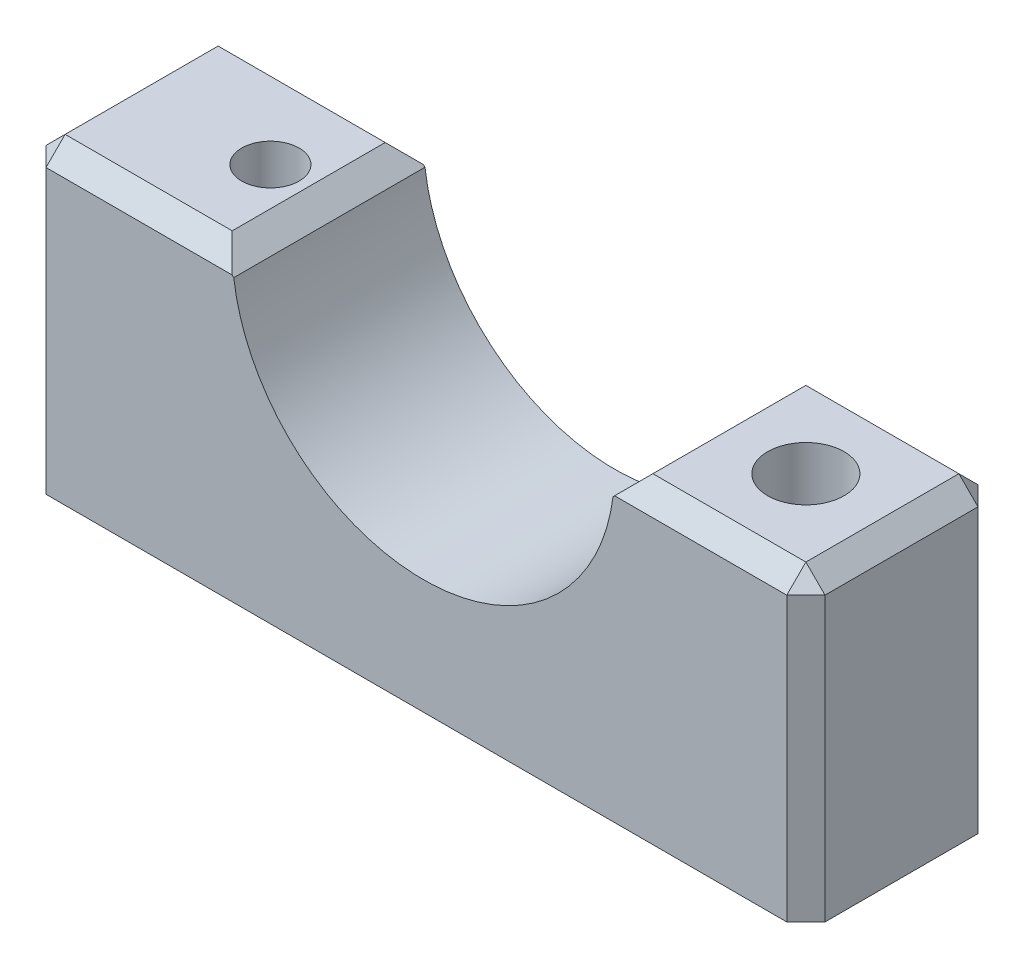
ISO-10303-21;
HEADER;
FILE_DESCRIPTION(('STEP AP214'),'2;1');
FILE_NAME('part.step','',(''),(''),'','','');
FILE_SCHEMA(('AUTOMOTIVE_DESIGN { 1 0 10303 214 1 1 1 1 }'));
ENDSEC;
DATA;
#1=APPLICATION_CONTEXT('core data for automotive mechanical design processes');
#2=APPLICATION_PROTOCOL_DEFINITION('international standard','automotive_design',2000,#1);
#3=PRODUCT_CONTEXT('',#1,'mechanical');
#4=PRODUCT('Part','Part','',(#3));
#5=PRODUCT_RELATED_PRODUCT_CATEGORY('part','',(#4));
#6=PRODUCT_DEFINITION_FORMATION('','',#4);
#7=PRODUCT_DEFINITION_CONTEXT('part definition',#1,'design');
#8=PRODUCT_DEFINITION('design','',#6,#7);
#9=PRODUCT_DEFINITION_SHAPE('','',#8);
#10=(LENGTH_UNIT() NAMED_UNIT(*) SI_UNIT(.MILLI.,.METRE.));
#11=(NAMED_UNIT(*) PLANE_ANGLE_UNIT() SI_UNIT($,.RADIAN.));
#12=(NAMED_UNIT(*) SI_UNIT($,.STERADIAN.) SOLID_ANGLE_UNIT());
#13=UNCERTAINTY_MEASURE_WITH_UNIT(LENGTH_MEASURE(1.E-05),#10,'distance_accuracy_value','');
#14=(GEOMETRIC_REPRESENTATION_CONTEXT(3) GLOBAL_UNCERTAINTY_ASSIGNED_CONTEXT((#13)) GLOBAL_UNIT_ASSIGNED_CONTEXT((#10,
#11,#12)) REPRESENTATION_CONTEXT('',''));
#15=CARTESIAN_POINT('',(0.,0.,0.));
#16=DIRECTION('',(0.,0.,1.));
#17=DIRECTION('',(1.,0.,0.));
#18=AXIS2_PLACEMENT_3D('',#15,#16,#17);
#19=CARTESIAN_POINT('',(-19.7351198682707,15.8,-5.));
#20=DIRECTION('',(0.707106781186547,0.,0.707106781186548));
#21=DIRECTION('',(0.,1.,0.));
#22=AXIS2_PLACEMENT_3D('',#19,#20,#21);
#23=PLANE('',#22);
#24=CARTESIAN_POINT('',(-20.2210739927541,2.7838656629798,-4.51404587551658));
#25=DIRECTION('',(0.707106781186547,0.,0.707106781186548));
#26=DIRECTION('',(-0.707106781186548,0.,0.707106781186547));
#27=AXIS2_PLACEMENT_3D('',#24,#25,#26);
#28=ELLIPSE('',#27,3.95979797464467,2.8);
#29=CARTESIAN_POINT('',(-20.7351198682707,5.53627494175074,-4.));
#30=VERTEX_POINT('',#29);
#31=CARTESIAN_POINT('',(-19.7351198682707,5.5413733400131,-5.));
#32=VERTEX_POINT('',#31);
#33=EDGE_CURVE('E204',#30,#32,#28,.F.);
#34=ORIENTED_EDGE('',*,*,#33,.F.);
#35=DIRECTION('',(0.,-1.,0.));
#36=VECTOR('',#35,1.);
#37=CARTESIAN_POINT('',(-20.7351198682707,1.98278893304149E-12,-4.));
#38=LINE('',#37,#36);
#39=CARTESIAN_POINT('',(-20.7351198682707,14.8,-4.));
#40=VERTEX_POINT('',#39);
#41=EDGE_CURVE('E202',#40,#30,#38,.T.);
#42=ORIENTED_EDGE('',*,*,#41,.F.);
#43=DIRECTION('',(0.707106781186548,0.,-0.707106781186547));
#44=VECTOR('',#43,1.);
#45=CARTESIAN_POINT('',(-20.2351198682707,14.8,-4.5));
#46=LINE('',#45,#44);
#47=CARTESIAN_POINT('',(-19.7351198682707,14.8,-5.));
#48=VERTEX_POINT('',#47);
#49=EDGE_CURVE('E264',#48,#40,#46,.F.);
#50=ORIENTED_EDGE('',*,*,#49,.F.);
#51=DIRECTION('',(0.,1.,0.));
#52=VECTOR('',#51,1.);
#53=CARTESIAN_POINT('',(-19.7351198682707,15.8,-5.));
#54=LINE('',#53,#52);
#55=EDGE_CURVE('E438',#32,#48,#54,.T.);
#56=ORIENTED_EDGE('',*,*,#55,.F.);
#57=EDGE_LOOP('',(#34,#42,#50,#56));
#58=FACE_BOUND('',#57,.T.);
#59=ADVANCED_FACE('F36',(#58),#23,.F.);
#60=CARTESIAN_POINT('',(-19.7351198682707,0.0263579859465096,-5.));
#61=VERTEX_POINT('',#60);
#62=CARTESIAN_POINT('',(-19.9209207477575,0.,-4.81419912051325));
#63=VERTEX_POINT('',#62);
#64=EDGE_CURVE('E201',#61,#63,#28,.F.);
#65=ORIENTED_EDGE('',*,*,#64,.F.);
#66=CARTESIAN_POINT('',(-19.7351198682707,0.,-5.));
#67=VERTEX_POINT('',#66);
#68=EDGE_CURVE('E429',#67,#61,#54,.T.);
#69=ORIENTED_EDGE('',*,*,#68,.F.);
#70=DIRECTION('',(-0.707106781186548,0.,0.707106781186547));
#71=VECTOR('',#70,1.);
#72=CARTESIAN_POINT('',(-19.7351198682707,0.,-5.));
#73=LINE('',#72,#71);
#74=EDGE_CURVE('E430',#63,#67,#73,.F.);
#75=ORIENTED_EDGE('',*,*,#74,.F.);
#76=EDGE_LOOP('',(#65,#69,#75));
#77=FACE_BOUND('',#76,.T.);
#78=ADVANCED_FACE('F410',(#77),#23,.F.);
#79=CARTESIAN_POINT('',(0.,15.8,0.));
#80=DIRECTION('',(0.,1.,0.));
#81=DIRECTION('',(0.,0.,1.));
#82=AXIS2_PLACEMENT_3D('',#79,#80,#81);
#83=PLANE('',#82);
#84=DIRECTION('',(1.,0.,0.));
#85=VECTOR('',#84,1.);
#86=CARTESIAN_POINT('',(-9.99799979996,15.8,4.));
#87=LINE('',#86,#85);
#88=CARTESIAN_POINT('',(-19.7351198682707,15.8,4.));
#89=VERTEX_POINT('',#88);
#90=CARTESIAN_POINT('',(-10.99799979996,15.8,4.));
#91=VERTEX_POINT('',#90);
#92=EDGE_CURVE('E476',#89,#91,#87,.T.);
#93=ORIENTED_EDGE('',*,*,#92,.T.);
#94=DIRECTION('',(0.,0.,-1.));
#95=VECTOR('',#94,1.);
#96=CARTESIAN_POINT('',(-10.99799979996,15.8,-5.));
#97=LINE('',#96,#95);
#98=CARTESIAN_POINT('',(-10.99799979996,15.8,-4.));
#99=VERTEX_POINT('',#98);
#100=EDGE_CURVE('E480',#91,#99,#97,.T.);
#101=ORIENTED_EDGE('',*,*,#100,.T.);
#102=DIRECTION('',(-1.,0.,0.));
#103=VECTOR('',#102,1.);
#104=CARTESIAN_POINT('',(-20.7351198682707,15.8,-4.));
#105=LINE('',#104,#103);
#106=CARTESIAN_POINT('',(-19.7351198682707,15.8,-4.));
#107=VERTEX_POINT('',#106);
#108=EDGE_CURVE('E478',#99,#107,#105,.T.);
#109=ORIENTED_EDGE('',*,*,#108,.T.);
#110=DIRECTION('',(0.,0.,1.));
#111=VECTOR('',#110,1.);
#112=CARTESIAN_POINT('',(-19.7351198682707,15.8,5.));
#113=LINE('',#112,#111);
#114=EDGE_CURVE('E474',#107,#89,#113,.T.);
#115=ORIENTED_EDGE('',*,*,#114,.T.);
#116=EDGE_LOOP('',(#93,#101,#109,#115));
#117=FACE_BOUND('',#116,.T.);
#118=CARTESIAN_POINT('',(-13.,15.8,0.));
#119=DIRECTION('',(0.,1.,0.));
#120=DIRECTION('',(0.,0.,1.));
#121=AXIS2_PLACEMENT_3D('',#118,#119,#120);
#122=CIRCLE('',#121,1.5);
#123=CARTESIAN_POINT('',(-13.,15.8,1.5));
#124=VERTEX_POINT('',#123);
#125=EDGE_CURVE('E526',#124,#124,#122,.T.);
#126=ORIENTED_EDGE('',*,*,#125,.F.);
#127=EDGE_LOOP('',(#126));
#128=FACE_BOUND('',#127,.T.);
#129=ADVANCED_FACE('F416',(#117,#128),#83,.T.);
#130=DIRECTION('',(-1.,0.,0.));
#131=VECTOR('',#130,1.);
#132=CARTESIAN_POINT('',(9.99799979996,15.8,-3.99999999999999));
#133=LINE('',#132,#131);
#134=CARTESIAN_POINT('',(19.,15.8,-3.99999999999999));
#135=VERTEX_POINT('',#134);
#136=CARTESIAN_POINT('',(10.99799979996,15.8,-3.99999999999999));
#137=VERTEX_POINT('',#136);
#138=EDGE_CURVE('E455',#135,#137,#133,.T.);
#139=ORIENTED_EDGE('',*,*,#138,.T.);
#140=DIRECTION('',(0.,0.,1.));
#141=VECTOR('',#140,1.);
#142=CARTESIAN_POINT('',(10.99799979996,15.8,5.));
#143=LINE('',#142,#141);
#144=CARTESIAN_POINT('',(10.99799979996,15.8,3.99999999999999));
#145=VERTEX_POINT('',#144);
#146=EDGE_CURVE('E459',#137,#145,#143,.T.);
#147=ORIENTED_EDGE('',*,*,#146,.T.);
#148=DIRECTION('',(1.,0.,0.));
#149=VECTOR('',#148,1.);
#150=CARTESIAN_POINT('',(20.,15.8,3.99999999999999));
#151=LINE('',#150,#149);
#152=CARTESIAN_POINT('',(19.,15.8,3.99999999999999));
#153=VERTEX_POINT('',#152);
#154=EDGE_CURVE('E457',#145,#153,#151,.T.);
#155=ORIENTED_EDGE('',*,*,#154,.T.);
#156=DIRECTION('',(0.,0.,-1.));
#157=VECTOR('',#156,1.);
#158=CARTESIAN_POINT('',(19.,15.8,-5.));
#159=LINE('',#158,#157);
#160=EDGE_CURVE('E453',#153,#135,#159,.T.);
#161=ORIENTED_EDGE('',*,*,#160,.T.);
#162=EDGE_LOOP('',(#139,#147,#155,#161));
#163=FACE_BOUND('',#162,.T.);
#164=CARTESIAN_POINT('',(15.,15.8,0.));
#165=DIRECTION('',(0.,1.,0.));
#166=DIRECTION('',(0.,0.,1.));
#167=AXIS2_PLACEMENT_3D('',#164,#165,#166);
#168=CIRCLE('',#167,2.);
#169=CARTESIAN_POINT('',(15.,15.8,2.));
#170=VERTEX_POINT('',#169);
#171=EDGE_CURVE('E520',#170,#170,#168,.T.);
#172=ORIENTED_EDGE('',*,*,#171,.F.);
#173=EDGE_LOOP('',(#172));
#174=FACE_BOUND('',#173,.T.);
#175=ADVANCED_FACE('F421',(#163,#174),#83,.T.);
#176=CARTESIAN_POINT('',(0.,0.,0.));
#177=DIRECTION('',(0.,1.,0.));
#178=DIRECTION('',(0.,0.,1.));
#179=AXIS2_PLACEMENT_3D('',#176,#177,#178);
#180=PLANE('',#179);
#181=DIRECTION('',(-1.,0.,0.));
#182=VECTOR('',#181,1.);
#183=CARTESIAN_POINT('',(-18.9351198682707,0.,-4.21389263051991));
#184=LINE('',#183,#182);
#185=CARTESIAN_POINT('',(-20.5212272377508,0.,-4.21389263051991));
#186=VERTEX_POINT('',#185);
#187=CARTESIAN_POINT('',(-19.4351198682707,0.,-4.21389263051991));
#188=VERTEX_POINT('',#187);
#189=EDGE_CURVE('E196',#186,#188,#184,.F.);
#190=ORIENTED_EDGE('',*,*,#189,.T.);
#191=CARTESIAN_POINT('',(-19.4351198682707,0.,-4.21389263051991));
#192=CARTESIAN_POINT('',(-19.4313810424922,0.,-4.21387913317386));
#193=CARTESIAN_POINT('',(-19.4276613431759,0.,-4.21428305676196));
#194=CARTESIAN_POINT('',(-19.4204196989587,0.,-4.21579695422611));
#195=CARTESIAN_POINT('',(-19.4168957177988,0.,-4.21689698903901));
#196=CARTESIAN_POINT('',(-19.4101146582667,0.,-4.21967240536886));
#197=CARTESIAN_POINT('',(-19.4068561287866,0.,-4.22134435652536));
#198=CARTESIAN_POINT('',(-19.400598319731,0.,-4.22513341580674));
#199=CARTESIAN_POINT('',(-19.3976000795394,0.,-4.22725220231526));
#200=CARTESIAN_POINT('',(-19.3895563942402,0.,-4.23366110845835));
#201=CARTESIAN_POINT('',(-19.3848101427737,0.,-4.23832422321387));
#202=CARTESIAN_POINT('',(-19.3760476001414,0.,-4.24828666655887));
#203=CARTESIAN_POINT('',(-19.3720335291475,0.,-4.25358785185492));
#204=CARTESIAN_POINT('',(-19.360844748602,0.,-4.27011486932161));
#205=CARTESIAN_POINT('',(-19.3545552721305,0.,-4.28193354134266));
#206=CARTESIAN_POINT('',(-19.3435934223491,0.,-4.30627393252372));
#207=CARTESIAN_POINT('',(-19.3389249586039,0.,-4.31879726789593));
#208=CARTESIAN_POINT('',(-19.3258891477024,0.,-4.3595057096732));
#209=CARTESIAN_POINT('',(-19.3198207428673,0.,-4.38842252844659));
#210=CARTESIAN_POINT('',(-19.3116197866411,0.,-4.44685547233927));
#211=CARTESIAN_POINT('',(-19.3095065650205,0.,-4.47637383171294));
#212=CARTESIAN_POINT('',(-19.3087977392633,0.,-4.53921188502588));
#213=CARTESIAN_POINT('',(-19.3106846273333,0.,-4.57253671905516));
#214=CARTESIAN_POINT('',(-19.3193932443883,0.,-4.63839923141753));
#215=CARTESIAN_POINT('',(-19.3261722206847,0.,-4.67094122201783));
#216=CARTESIAN_POINT('',(-19.3392594639429,0.,-4.70981796296075));
#217=CARTESIAN_POINT('',(-19.342036027177,0.,-4.71733555947856));
#218=CARTESIAN_POINT('',(-19.3481537951946,0.,-4.7321808161283));
#219=CARTESIAN_POINT('',(-19.3514974518704,0.,-4.73950748492457));
#220=CARTESIAN_POINT('',(-19.3598700716283,0.,-4.75579974385417));
#221=CARTESIAN_POINT('',(-19.3651094210256,0.,-4.7646587865983));
#222=CARTESIAN_POINT('',(-19.3770625232808,0.,-4.78132131766806));
#223=CARTESIAN_POINT('',(-19.3837641539983,0.,-4.7891326785205));
#224=CARTESIAN_POINT('',(-19.3943398357853,0.,-4.79833195324178));
#225=CARTESIAN_POINT('',(-19.3973655883036,0.,-4.80068458576905));
#226=CARTESIAN_POINT('',(-19.4037159751665,0.,-4.80495156659268));
#227=CARTESIAN_POINT('',(-19.4070403894557,0.,-4.8068662339546));
#228=CARTESIAN_POINT('',(-19.4134660518498,0.,-4.80987758447169));
#229=CARTESIAN_POINT('',(-19.416530168103,0.,-4.81105247496181));
#230=CARTESIAN_POINT('',(-19.4228084346918,0.,-4.81287441134433));
#231=CARTESIAN_POINT('',(-19.426022189039,0.,-4.81352277503577));
#232=CARTESIAN_POINT('',(-19.431209936898,0.,-4.81409291182164));
#233=CARTESIAN_POINT('',(-19.4331647711745,0.,-4.81420171723716));
#234=CARTESIAN_POINT('',(-19.4351198682707,0.,-4.8141991205133));
#235=B_SPLINE_CURVE_WITH_KNOTS('',3,(#191,#192,#193,#194,#195,#196,#197,#198,#199,#200,#201,
#202,#203,#204,#205,#206,#207,#208,#209,#210,#211,#212,#213,#214,#215,#216,#217,#218,#219,#220,
#221,#222,#223,#224,#225,#226,#227,#228,#229,#230,#231,#232,#233,#234),.UNSPECIFIED.,.F.,.F.,(4,
2,2,2,2,2,2,2,2,2,2,2,2,2,2,2,2,2,2,2,2,4),(0.,0.0111644738153716,0.02217303112856,
0.0331166843087431,0.0441021999975022,0.0639478582902646,0.0838527283961917,0.123791819017559,
0.163826576519271,0.251983033196454,0.340569214325398,0.440442335190599,0.539453058798515,
0.563478851238478,0.587611301276353,0.618412058724422,0.648966576267191,0.660437127701687,
0.671899295826087,0.681705728344835,0.691487540873906,0.697350297987625),.UNSPECIFIED.);
#236=CARTESIAN_POINT('',(-19.4351198682707,0.,-4.81419912051325));
#237=VERTEX_POINT('',#236);
#238=EDGE_CURVE('E50',#188,#237,#235,.T.);
#239=ORIENTED_EDGE('',*,*,#238,.T.);
#240=DIRECTION('',(-1.,0.,0.));
#241=VECTOR('',#240,1.);
#242=CARTESIAN_POINT('',(-18.9351198682707,0.,-4.81419912051325));
#243=LINE('',#242,#241);
#244=EDGE_CURVE('E511',#237,#63,#243,.T.);
#245=ORIENTED_EDGE('',*,*,#244,.T.);
#246=ORIENTED_EDGE('',*,*,#74,.T.);
#247=DIRECTION('',(-1.,0.,0.));
#248=VECTOR('',#247,1.);
#249=CARTESIAN_POINT('',(-18.,0.,-5.));
#250=LINE('',#249,#248);
#251=CARTESIAN_POINT('',(19.,0.,-5.));
#252=VERTEX_POINT('',#251);
#253=EDGE_CURVE('E436',#252,#67,#250,.T.);
#254=ORIENTED_EDGE('',*,*,#253,.F.);
#255=DIRECTION('',(-0.707106781186549,0.,-0.707106781186546));
#256=VECTOR('',#255,1.);
#257=CARTESIAN_POINT('',(19.,0.,-5.));
#258=LINE('',#257,#256);
#259=CARTESIAN_POINT('',(20.,0.,-3.99999999999999));
#260=VERTEX_POINT('',#259);
#261=EDGE_CURVE('E488',#252,#260,#258,.F.);
#262=ORIENTED_EDGE('',*,*,#261,.T.);
#263=DIRECTION('',(0.,0.,-1.));
#264=VECTOR('',#263,1.);
#265=CARTESIAN_POINT('',(20.,0.,-5.));
#266=LINE('',#265,#264);
#267=CARTESIAN_POINT('',(20.,0.,3.99999999999999));
#268=VERTEX_POINT('',#267);
#269=EDGE_CURVE('E529',#268,#260,#266,.T.);
#270=ORIENTED_EDGE('',*,*,#269,.F.);
#271=DIRECTION('',(0.707106781186549,0.,-0.707106781186546));
#272=VECTOR('',#271,1.);
#273=CARTESIAN_POINT('',(20.,0.,3.99999999999999));
#274=LINE('',#273,#272);
#275=CARTESIAN_POINT('',(19.,0.,5.));
#276=VERTEX_POINT('',#275);
#277=EDGE_CURVE('E486',#268,#276,#274,.F.);
#278=ORIENTED_EDGE('',*,*,#277,.T.);
#279=DIRECTION('',(1.,0.,0.));
#280=VECTOR('',#279,1.);
#281=CARTESIAN_POINT('',(-18.,0.,5.));
#282=LINE('',#281,#280);
#283=CARTESIAN_POINT('',(-19.7351198682707,0.,5.));
#284=VERTEX_POINT('',#283);
#285=EDGE_CURVE('E535',#284,#276,#282,.T.);
#286=ORIENTED_EDGE('',*,*,#285,.F.);
#287=DIRECTION('',(0.707106781186547,0.,0.707106781186548));
#288=VECTOR('',#287,1.);
#289=CARTESIAN_POINT('',(-19.7351198682707,0.,5.));
#290=LINE('',#289,#288);
#291=CARTESIAN_POINT('',(-20.7351198682707,0.,4.));
#292=VERTEX_POINT('',#291);
#293=EDGE_CURVE('E483',#284,#292,#290,.F.);
#294=ORIENTED_EDGE('',*,*,#293,.T.);
#295=DIRECTION('',(0.,0.,-1.));
#296=VECTOR('',#295,1.);
#297=CARTESIAN_POINT('',(-20.7351198682707,0.,-5.));
#298=LINE('',#297,#296);
#299=CARTESIAN_POINT('',(-20.7351198682707,0.,-4.));
#300=VERTEX_POINT('',#299);
#301=EDGE_CURVE('E245',#292,#300,#298,.T.);
#302=ORIENTED_EDGE('',*,*,#301,.T.);
#303=EDGE_CURVE('E214',#300,#186,#73,.F.);
#304=ORIENTED_EDGE('',*,*,#303,.T.);
#305=EDGE_LOOP('',(#190,#239,#245,#246,#254,#262,#270,#278,#286,#294,#302,#304));
#306=FACE_BOUND('',#305,.T.);
#307=CARTESIAN_POINT('',(-13.,0.,0.));
#308=DIRECTION('',(0.,1.,0.));
#309=DIRECTION('',(0.,0.,1.));
#310=AXIS2_PLACEMENT_3D('',#307,#308,#309);
#311=CIRCLE('',#310,1.5);
#312=CARTESIAN_POINT('',(-13.,0.,1.5));
#313=VERTEX_POINT('',#312);
#314=EDGE_CURVE('E523',#313,#313,#311,.T.);
#315=ORIENTED_EDGE('',*,*,#314,.T.);
#316=EDGE_LOOP('',(#315));
#317=FACE_BOUND('',#316,.T.);
#318=CARTESIAN_POINT('',(15.,0.,0.));
#319=DIRECTION('',(0.,1.,0.));
#320=DIRECTION('',(0.,0.,1.));
#321=AXIS2_PLACEMENT_3D('',#318,#319,#320);
#322=CIRCLE('',#321,2.);
#323=CARTESIAN_POINT('',(15.,0.,2.));
#324=VERTEX_POINT('',#323);
#325=EDGE_CURVE('E519',#324,#324,#322,.T.);
#326=ORIENTED_EDGE('',*,*,#325,.T.);
#327=EDGE_LOOP('',(#326));
#328=FACE_BOUND('',#327,.T.);
#329=ADVANCED_FACE('F299',(#306,#317,#328),#180,.F.);
#330=CARTESIAN_POINT('',(20.,15.8,-5.));
#331=DIRECTION('',(-1.,0.,0.));
#332=DIRECTION('',(0.,0.,1.));
#333=AXIS2_PLACEMENT_3D('',#330,#331,#332);
#334=PLANE('',#333);
#335=ORIENTED_EDGE('',*,*,#269,.T.);
#336=DIRECTION('',(0.,1.,0.));
#337=VECTOR('',#336,1.);
#338=CARTESIAN_POINT('',(20.,15.8,-3.99999999999999));
#339=LINE('',#338,#337);
#340=CARTESIAN_POINT('',(20.,14.8,-3.99999999999999));
#341=VERTEX_POINT('',#340);
#342=EDGE_CURVE('E494',#260,#341,#339,.T.);
#343=ORIENTED_EDGE('',*,*,#342,.T.);
#344=DIRECTION('',(0.,0.,1.));
#345=VECTOR('',#344,1.);
#346=CARTESIAN_POINT('',(20.,14.8,5.));
#347=LINE('',#346,#345);
#348=CARTESIAN_POINT('',(20.,14.8,3.99999999999999));
#349=VERTEX_POINT('',#348);
#350=EDGE_CURVE('E490',#341,#349,#347,.T.);
#351=ORIENTED_EDGE('',*,*,#350,.T.);
#352=DIRECTION('',(0.,-1.,0.));
#353=VECTOR('',#352,1.);
#354=CARTESIAN_POINT('',(20.,15.8,3.99999999999999));
#355=LINE('',#354,#353);
#356=EDGE_CURVE('E492',#349,#268,#355,.T.);
#357=ORIENTED_EDGE('',*,*,#356,.T.);
#358=EDGE_LOOP('',(#335,#343,#351,#357));
#359=FACE_BOUND('',#358,.T.);
#360=ADVANCED_FACE('F294',(#359),#334,.F.);
#361=CARTESIAN_POINT('',(-18.,15.8,-5.));
#362=DIRECTION('',(0.,0.,1.));
#363=DIRECTION('',(1.,0.,0.));
#364=AXIS2_PLACEMENT_3D('',#361,#362,#363);
#365=PLANE('',#364);
#366=DIRECTION('',(0.,-1.,0.));
#367=VECTOR('',#366,1.);
#368=CARTESIAN_POINT('',(-18.9351198682707,15.8,-5.));
#369=LINE('',#368,#367);
#370=CARTESIAN_POINT('',(-18.9351198682707,5.03194230511137,-5.));
#371=VERTEX_POINT('',#370);
#372=CARTESIAN_POINT('',(-18.9351198682707,0.535789020848232,-5.));
#373=VERTEX_POINT('',#372);
#374=EDGE_CURVE('E269',#371,#373,#369,.T.);
#375=ORIENTED_EDGE('',*,*,#374,.F.);
#376=CARTESIAN_POINT('',(-18.9351198682707,5.03194230511137,-5.));
#377=CARTESIAN_POINT('',(-18.9350967117054,5.06104456182236,-5.));
#378=CARTESIAN_POINT('',(-18.937546081478,5.09014679720615,-5.));
#379=CARTESIAN_POINT('',(-18.9472525902724,5.14753743241438,-5.));
#380=CARTESIAN_POINT('',(-18.9545096179752,5.1758258510665,-5.));
#381=CARTESIAN_POINT('',(-18.9737025430467,5.23080046351944,-5.));
#382=CARTESIAN_POINT('',(-18.985642518639,5.25748523733668,-5.));
#383=CARTESIAN_POINT('',(-19.0138866168703,5.308423577815,-5.));
#384=CARTESIAN_POINT('',(-19.0301888611976,5.33267818469738,-5.));
#385=CARTESIAN_POINT('',(-19.066477794981,5.37772613588793,-5.));
#386=CARTESIAN_POINT('',(-19.0864129088312,5.39856101156667,-5.));
#387=CARTESIAN_POINT('',(-19.1295605983609,5.43651895245994,-5.));
#388=CARTESIAN_POINT('',(-19.152773753704,5.45364135982938,-5.));
#389=CARTESIAN_POINT('',(-19.2013676211438,5.48336441596684,-5.));
#390=CARTESIAN_POINT('',(-19.2267028751971,5.49603949942158,-5.));
#391=CARTESIAN_POINT('',(-19.2791537386339,5.51688340205466,-5.));
#392=CARTESIAN_POINT('',(-19.3062678623442,5.52505592937865,-5.));
#393=CARTESIAN_POINT('',(-19.3505109718783,5.53435000855382,-5.));
#394=CARTESIAN_POINT('',(-19.3673370554203,5.53698241791821,-5.));
#395=CARTESIAN_POINT('',(-19.401146118257,5.54049352911248,-5.));
#396=CARTESIAN_POINT('',(-19.4181288301202,5.54137480688648,-5.));
#397=CARTESIAN_POINT('',(-19.4351198682707,5.54137334001309,-5.));
#398=B_SPLINE_CURVE_WITH_KNOTS('',3,(#376,#377,#378,#379,#380,#381,#382,#383,#384,#385,#386,
#387,#388,#389,#390,#391,#392,#393,#394,#395,#396,#397),.UNSPECIFIED.,.F.,.F.,(4,2,2,2,2,2,2,2,
2,2,4),(0.,0.0872045075069612,0.174406995908372,0.261685595284156,0.348926674420733,
0.435014042296966,0.521116652310992,0.605700437830247,0.690214458611445,0.741223535876962,
0.792157522215566),.UNSPECIFIED.);
#399=CARTESIAN_POINT('',(-19.4351198682707,5.54137334001309,-5.));
#400=VERTEX_POINT('',#399);
#401=EDGE_CURVE('E278',#371,#400,#398,.T.);
#402=ORIENTED_EDGE('',*,*,#401,.T.);
#403=DIRECTION('',(-1.,0.,0.));
#404=VECTOR('',#403,1.);
#405=CARTESIAN_POINT('',(-18.9351198682707,5.54137334001309,-5.));
#406=LINE('',#405,#404);
#407=EDGE_CURVE('E250',#400,#32,#406,.T.);
#408=ORIENTED_EDGE('',*,*,#407,.T.);
#409=ORIENTED_EDGE('',*,*,#55,.T.);
#410=DIRECTION('',(1.,0.,0.));
#411=VECTOR('',#410,1.);
#412=CARTESIAN_POINT('',(-9.99799979996,14.8,-5.));
#413=LINE('',#412,#411);
#414=CARTESIAN_POINT('',(-9.99799979996001,14.8,-5.));
#415=VERTEX_POINT('',#414);
#416=EDGE_CURVE('E437',#48,#415,#413,.T.);
#417=ORIENTED_EDGE('',*,*,#416,.T.);
#418=DIRECTION('',(-0.707106781186546,0.707106781186549,0.));
#419=VECTOR('',#418,1.);
#420=CARTESIAN_POINT('',(-9.91770342303226,14.7197036230723,-5.));
#421=LINE('',#420,#419);
#422=CARTESIAN_POINT('',(-9.91770342303226,14.7197036230723,-5.));
#423=VERTEX_POINT('',#422);
#424=EDGE_CURVE('E440',#415,#423,#421,.F.);
#425=ORIENTED_EDGE('',*,*,#424,.T.);
#426=CARTESIAN_POINT('',(0.,16.,-5.));
#427=DIRECTION('',(0.,0.,1.));
#428=DIRECTION('',(1.,0.,0.));
#429=AXIS2_PLACEMENT_3D('',#426,#427,#428);
#430=CIRCLE('',#429,10.);
#431=CARTESIAN_POINT('',(9.91770342303226,14.7197036230723,-5.));
#432=VERTEX_POINT('',#431);
#433=EDGE_CURVE('E517',#423,#432,#430,.T.);
#434=ORIENTED_EDGE('',*,*,#433,.T.);
#435=DIRECTION('',(0.707106781186546,0.707106781186549,0.));
#436=VECTOR('',#435,1.);
#437=CARTESIAN_POINT('',(9.91770342303226,14.7197036230723,-5.));
#438=LINE('',#437,#436);
#439=CARTESIAN_POINT('',(9.99799979996,14.8,-5.));
#440=VERTEX_POINT('',#439);
#441=EDGE_CURVE('E451',#432,#440,#438,.T.);
#442=ORIENTED_EDGE('',*,*,#441,.T.);
#443=DIRECTION('',(1.,0.,0.));
#444=VECTOR('',#443,1.);
#445=CARTESIAN_POINT('',(20.,14.8,-5.));
#446=LINE('',#445,#444);
#447=CARTESIAN_POINT('',(19.,14.8,-5.));
#448=VERTEX_POINT('',#447);
#449=EDGE_CURVE('E449',#440,#448,#446,.T.);
#450=ORIENTED_EDGE('',*,*,#449,.T.);
#451=DIRECTION('',(0.,-1.,0.));
#452=VECTOR('',#451,1.);
#453=CARTESIAN_POINT('',(19.,15.8,-5.));
#454=LINE('',#453,#452);
#455=EDGE_CURVE('E447',#448,#252,#454,.T.);
#456=ORIENTED_EDGE('',*,*,#455,.T.);
#457=ORIENTED_EDGE('',*,*,#253,.T.);
#458=ORIENTED_EDGE('',*,*,#68,.T.);
#459=DIRECTION('',(-1.,0.,0.));
#460=VECTOR('',#459,1.);
#461=CARTESIAN_POINT('',(-18.9351198682707,0.0263579859465075,-5.));
#462=LINE('',#461,#460);
#463=CARTESIAN_POINT('',(-19.4351198682707,0.0263579859465073,-5.));
#464=VERTEX_POINT('',#463);
#465=EDGE_CURVE('E433',#61,#464,#462,.F.);
#466=ORIENTED_EDGE('',*,*,#465,.T.);
#467=CARTESIAN_POINT('',(-19.4351198682707,0.0263579859465073,-5.));
#468=CARTESIAN_POINT('',(-19.4073168487188,0.0263326308823944,-5.));
#469=CARTESIAN_POINT('',(-19.3795230638414,0.0287111509479884,-5.));
#470=CARTESIAN_POINT('',(-19.3247576062034,0.0380864040327068,-5.));
#471=CARTESIAN_POINT('',(-19.2977850118256,0.0450777439653503,-5.));
#472=CARTESIAN_POINT('',(-19.2453877700149,0.0634931781693191,-5.));
#473=CARTESIAN_POINT('',(-19.2199636763364,0.0749188475438961,-5.));
#474=CARTESIAN_POINT('',(-19.1713815904664,0.101849555438325,-5.));
#475=CARTESIAN_POINT('',(-19.14822343653,0.117354302497623,-5.));
#476=CARTESIAN_POINT('',(-19.1046720632848,0.152088855788451,-5.));
#477=CARTESIAN_POINT('',(-19.0842957797596,0.171339886098937,-5.));
#478=CARTESIAN_POINT('',(-19.0470056092095,0.212948905778996,-5.));
#479=CARTESIAN_POINT('',(-19.0300923852602,0.235307488781804,-5.));
#480=CARTESIAN_POINT('',(-18.9999410998767,0.282839155747757,-5.));
#481=CARTESIAN_POINT('',(-18.986760712136,0.308048778320128,-5.));
#482=CARTESIAN_POINT('',(-18.9647373095826,0.360293688988722,-5.));
#483=CARTESIAN_POINT('',(-18.955893180912,0.387328506213743,-5.));
#484=CARTESIAN_POINT('',(-18.9445938053092,0.434688416057621,-5.));
#485=CARTESIAN_POINT('',(-18.9410408124859,0.454759366018385,-5.));
#486=CARTESIAN_POINT('',(-18.9363039491457,0.495147954225745,-5.));
#487=CARTESIAN_POINT('',(-18.9351164692946,0.515465168983341,-5.));
#488=CARTESIAN_POINT('',(-18.9351198682707,0.535789020848231,-5.));
#489=B_SPLINE_CURVE_WITH_KNOTS('',3,(#467,#468,#469,#470,#471,#472,#473,#474,#475,#476,#477,
#478,#479,#480,#481,#482,#483,#484,#485,#486,#487,#488),.UNSPECIFIED.,.F.,.F.,(4,2,2,2,2,2,2,2,
2,2,4),(0.,0.0832938646856614,0.166490518357311,0.249716751119721,0.33293703876886,
0.416643298428129,0.500365570459452,0.585318440015137,0.670249476217035,0.731266136477557,
0.792189625095982),.UNSPECIFIED.);
#490=EDGE_CURVE('E11',#464,#373,#489,.T.);
#491=ORIENTED_EDGE('',*,*,#490,.T.);
#492=EDGE_LOOP('',(#375,#402,#408,#409,#417,#425,#434,#442,#450,#456,#457,#458,#466,#491));
#493=FACE_BOUND('',#492,.T.);
#494=ADVANCED_FACE('F288',(#493),#365,.F.);
#495=CARTESIAN_POINT('',(-18.,15.8,5.));
#496=DIRECTION('',(0.,0.,-1.));
#497=DIRECTION('',(-1.,0.,0.));
#498=AXIS2_PLACEMENT_3D('',#495,#496,#497);
#499=PLANE('',#498);
#500=DIRECTION('',(-1.,0.,0.));
#501=VECTOR('',#500,1.);
#502=CARTESIAN_POINT('',(9.99799979996,14.8,5.));
#503=LINE('',#502,#501);
#504=CARTESIAN_POINT('',(19.,14.8,5.));
#505=VERTEX_POINT('',#504);
#506=CARTESIAN_POINT('',(9.99799979996,14.8,5.));
#507=VERTEX_POINT('',#506);
#508=EDGE_CURVE('E470',#505,#507,#503,.T.);
#509=ORIENTED_EDGE('',*,*,#508,.T.);
#510=DIRECTION('',(-0.707106781186546,-0.707106781186549,0.));
#511=VECTOR('',#510,1.);
#512=CARTESIAN_POINT('',(9.91770342303226,14.7197036230723,5.));
#513=LINE('',#512,#511);
#514=CARTESIAN_POINT('',(9.91770342303226,14.7197036230723,5.));
#515=VERTEX_POINT('',#514);
#516=EDGE_CURVE('E472',#507,#515,#513,.T.);
#517=ORIENTED_EDGE('',*,*,#516,.T.);
#518=CARTESIAN_POINT('',(0.,16.,5.));
#519=DIRECTION('',(0.,0.,-1.));
#520=DIRECTION('',(-1.,0.,0.));
#521=AXIS2_PLACEMENT_3D('',#518,#519,#520);
#522=CIRCLE('',#521,10.);
#523=CARTESIAN_POINT('',(-9.91770342303226,14.7197036230723,5.));
#524=VERTEX_POINT('',#523);
#525=EDGE_CURVE('E538',#515,#524,#522,.T.);
#526=ORIENTED_EDGE('',*,*,#525,.T.);
#527=DIRECTION('',(0.707106781186546,-0.707106781186549,0.));
#528=VECTOR('',#527,1.);
#529=CARTESIAN_POINT('',(-9.91770342303226,14.7197036230723,5.));
#530=LINE('',#529,#528);
#531=CARTESIAN_POINT('',(-9.99799979996001,14.8,5.));
#532=VERTEX_POINT('',#531);
#533=EDGE_CURVE('E466',#524,#532,#530,.F.);
#534=ORIENTED_EDGE('',*,*,#533,.T.);
#535=DIRECTION('',(-1.,0.,0.));
#536=VECTOR('',#535,1.);
#537=CARTESIAN_POINT('',(-20.7351198682707,14.8,5.));
#538=LINE('',#537,#536);
#539=CARTESIAN_POINT('',(-19.7351198682707,14.8,5.));
#540=VERTEX_POINT('',#539);
#541=EDGE_CURVE('E464',#532,#540,#538,.T.);
#542=ORIENTED_EDGE('',*,*,#541,.T.);
#543=DIRECTION('',(0.,-1.,0.));
#544=VECTOR('',#543,1.);
#545=CARTESIAN_POINT('',(-19.7351198682707,15.8,5.));
#546=LINE('',#545,#544);
#547=EDGE_CURVE('E462',#540,#284,#546,.T.);
#548=ORIENTED_EDGE('',*,*,#547,.T.);
#549=ORIENTED_EDGE('',*,*,#285,.T.);
#550=DIRECTION('',(0.,1.,0.));
#551=VECTOR('',#550,1.);
#552=CARTESIAN_POINT('',(19.,15.8,5.));
#553=LINE('',#552,#551);
#554=EDGE_CURVE('E468',#276,#505,#553,.T.);
#555=ORIENTED_EDGE('',*,*,#554,.T.);
#556=EDGE_LOOP('',(#509,#517,#526,#534,#542,#548,#549,#555));
#557=FACE_BOUND('',#556,.T.);
#558=ADVANCED_FACE('F293',(#557),#499,.F.);
#559=CARTESIAN_POINT('',(-13.,15.8,0.));
#560=DIRECTION('',(0.,-1.,0.));
#561=DIRECTION('',(0.,0.,-1.));
#562=AXIS2_PLACEMENT_3D('',#559,#560,#561);
#563=CYLINDRICAL_SURFACE('',#562,1.5);
#564=ORIENTED_EDGE('',*,*,#125,.T.);
#565=EDGE_LOOP('',(#564));
#566=FACE_BOUND('',#565,.T.);
#567=ORIENTED_EDGE('',*,*,#314,.F.);
#568=EDGE_LOOP('',(#567));
#569=FACE_BOUND('',#568,.T.);
#570=ADVANCED_FACE('F586',(#566,#569),#563,.F.);
#571=CARTESIAN_POINT('',(15.,15.8,0.));
#572=DIRECTION('',(0.,-1.,0.));
#573=DIRECTION('',(0.,0.,-1.));
#574=AXIS2_PLACEMENT_3D('',#571,#572,#573);
#575=CYLINDRICAL_SURFACE('',#574,2.);
#576=ORIENTED_EDGE('',*,*,#171,.T.);
#577=EDGE_LOOP('',(#576));
#578=FACE_BOUND('',#577,.T.);
#579=ORIENTED_EDGE('',*,*,#325,.F.);
#580=EDGE_LOOP('',(#579));
#581=FACE_BOUND('',#580,.T.);
#582=ADVANCED_FACE('F583',(#578,#581),#575,.F.);
#583=CARTESIAN_POINT('',(0.,16.,-5.));
#584=DIRECTION('',(0.,0.,1.));
#585=DIRECTION('',(1.,0.,0.));
#586=AXIS2_PLACEMENT_3D('',#583,#584,#585);
#587=CYLINDRICAL_SURFACE('',#586,10.);
#588=ORIENTED_EDGE('',*,*,#525,.F.);
#589=DIRECTION('',(0.,0.,1.));
#590=VECTOR('',#589,1.);
#591=CARTESIAN_POINT('',(9.91770342303226,14.7197036230723,-5.));
#592=LINE('',#591,#590);
#593=EDGE_CURVE('E442',#515,#432,#592,.F.);
#594=ORIENTED_EDGE('',*,*,#593,.T.);
#595=ORIENTED_EDGE('',*,*,#433,.F.);
#596=DIRECTION('',(0.,0.,1.));
#597=VECTOR('',#596,1.);
#598=CARTESIAN_POINT('',(-9.91770342303226,14.7197036230723,-5.));
#599=LINE('',#598,#597);
#600=EDGE_CURVE('E540',#423,#524,#599,.T.);
#601=ORIENTED_EDGE('',*,*,#600,.T.);
#602=EDGE_LOOP('',(#588,#594,#595,#601));
#603=FACE_BOUND('',#602,.T.);
#604=ADVANCED_FACE('F547',(#603),#587,.F.);
#605=CARTESIAN_POINT('',(-20.7351198682707,1.98278893304149E-12,-17.735954124484));
#606=DIRECTION('',(1.,0.,0.));
#607=DIRECTION('',(0.,0.,-1.));
#608=AXIS2_PLACEMENT_3D('',#605,#606,#607);
#609=PLANE('',#608);
#610=ORIENTED_EDGE('',*,*,#41,.T.);
#611=CARTESIAN_POINT('',(-20.7351198682707,2.7838656629798,-4.51404587551658));
#612=DIRECTION('',(-1.,0.,0.));
#613=DIRECTION('',(0.,-1.,0.));
#614=AXIS2_PLACEMENT_3D('',#611,#612,#613);
#615=CIRCLE('',#614,2.8);
#616=CARTESIAN_POINT('',(-20.7351198682707,0.0314563842088566,-4.));
#617=VERTEX_POINT('',#616);
#618=EDGE_CURVE('E194',#617,#30,#615,.T.);
#619=ORIENTED_EDGE('',*,*,#618,.F.);
#620=EDGE_CURVE('E209',#617,#300,#38,.T.);
#621=ORIENTED_EDGE('',*,*,#620,.T.);
#622=ORIENTED_EDGE('',*,*,#301,.F.);
#623=DIRECTION('',(0.,1.,0.));
#624=VECTOR('',#623,1.);
#625=CARTESIAN_POINT('',(-20.7351198682707,1.98278893304149E-12,4.));
#626=LINE('',#625,#624);
#627=CARTESIAN_POINT('',(-20.7351198682707,14.8,4.));
#628=VERTEX_POINT('',#627);
#629=EDGE_CURVE('E215',#292,#628,#626,.T.);
#630=ORIENTED_EDGE('',*,*,#629,.T.);
#631=DIRECTION('',(0.,0.,-1.));
#632=VECTOR('',#631,1.);
#633=CARTESIAN_POINT('',(-20.7351198682707,14.8,-5.));
#634=LINE('',#633,#632);
#635=EDGE_CURVE('E217',#628,#40,#634,.T.);
#636=ORIENTED_EDGE('',*,*,#635,.T.);
#637=EDGE_LOOP('',(#610,#619,#621,#622,#630,#636));
#638=FACE_BOUND('',#637,.T.);
#639=ADVANCED_FACE('F207',(#638),#609,.F.);
#640=CARTESIAN_POINT('',(20.,15.8,3.99999999999999));
#641=DIRECTION('',(-0.707106781186546,0.,-0.707106781186549));
#642=DIRECTION('',(0.,-1.,0.));
#643=AXIS2_PLACEMENT_3D('',#640,#641,#642);
#644=PLANE('',#643);
#645=ORIENTED_EDGE('',*,*,#277,.F.);
#646=ORIENTED_EDGE('',*,*,#356,.F.);
#647=DIRECTION('',(-0.707106781186549,0.,0.707106781186546));
#648=VECTOR('',#647,1.);
#649=CARTESIAN_POINT('',(19.5,14.8,4.5));
#650=LINE('',#649,#648);
#651=EDGE_CURVE('E239',#505,#349,#650,.F.);
#652=ORIENTED_EDGE('',*,*,#651,.F.);
#653=ORIENTED_EDGE('',*,*,#554,.F.);
#654=EDGE_LOOP('',(#645,#646,#652,#653));
#655=FACE_BOUND('',#654,.T.);
#656=ADVANCED_FACE('F351',(#655),#644,.F.);
#657=CARTESIAN_POINT('',(19.,15.8,-5.));
#658=DIRECTION('',(-0.707106781186546,0.,0.707106781186549));
#659=DIRECTION('',(0.,-1.,0.));
#660=AXIS2_PLACEMENT_3D('',#657,#658,#659);
#661=PLANE('',#660);
#662=ORIENTED_EDGE('',*,*,#261,.F.);
#663=ORIENTED_EDGE('',*,*,#455,.F.);
#664=DIRECTION('',(0.707106781186549,0.,0.707106781186546));
#665=VECTOR('',#664,1.);
#666=CARTESIAN_POINT('',(19.,14.8,-5.));
#667=LINE('',#666,#665);
#668=EDGE_CURVE('E236',#341,#448,#667,.F.);
#669=ORIENTED_EDGE('',*,*,#668,.F.);
#670=ORIENTED_EDGE('',*,*,#342,.F.);
#671=EDGE_LOOP('',(#662,#663,#669,#670));
#672=FACE_BOUND('',#671,.T.);
#673=ADVANCED_FACE('F344',(#672),#661,.F.);
#674=CARTESIAN_POINT('',(19.,15.8,0.));
#675=DIRECTION('',(0.707106781186547,0.707106781186547,0.));
#676=DIRECTION('',(0.,0.,1.));
#677=AXIS2_PLACEMENT_3D('',#674,#675,#676);
#678=PLANE('',#677);
#679=DIRECTION('',(-0.707106781186548,0.707106781186548,0.));
#680=VECTOR('',#679,1.);
#681=CARTESIAN_POINT('',(19.,15.8,3.99999999999999));
#682=LINE('',#681,#680);
#683=EDGE_CURVE('E242',#349,#153,#682,.T.);
#684=ORIENTED_EDGE('',*,*,#683,.F.);
#685=ORIENTED_EDGE('',*,*,#350,.F.);
#686=DIRECTION('',(0.707106781186548,-0.707106781186548,0.));
#687=VECTOR('',#686,1.);
#688=CARTESIAN_POINT('',(19.5,15.3,-3.99999999999999));
#689=LINE('',#688,#687);
#690=EDGE_CURVE('E233',#135,#341,#689,.T.);
#691=ORIENTED_EDGE('',*,*,#690,.F.);
#692=ORIENTED_EDGE('',*,*,#160,.F.);
#693=EDGE_LOOP('',(#684,#685,#691,#692));
#694=FACE_BOUND('',#693,.T.);
#695=ADVANCED_FACE('F337',(#694),#678,.T.);
#696=CARTESIAN_POINT('',(19.,15.8,3.99999999999999));
#697=DIRECTION('',(0.577350269189625,0.577350269189625,0.577350269189627));
#698=DIRECTION('',(0.707106781186549,0.,-0.707106781186546));
#699=AXIS2_PLACEMENT_3D('',#696,#697,#698);
#700=PLANE('',#699);
#701=ORIENTED_EDGE('',*,*,#651,.T.);
#702=ORIENTED_EDGE('',*,*,#683,.T.);
#703=DIRECTION('',(0.,-0.707106781186547,0.707106781186547));
#704=VECTOR('',#703,1.);
#705=CARTESIAN_POINT('',(19.,15.8,3.99999999999999));
#706=LINE('',#705,#704);
#707=EDGE_CURVE('E230',#505,#153,#706,.F.);
#708=ORIENTED_EDGE('',*,*,#707,.F.);
#709=EDGE_LOOP('',(#701,#702,#708));
#710=FACE_BOUND('',#709,.T.);
#711=ADVANCED_FACE('F330',(#710),#700,.T.);
#712=CARTESIAN_POINT('',(19.,14.8,-5.));
#713=DIRECTION('',(0.577350269189625,0.577350269189625,-0.577350269189627));
#714=DIRECTION('',(0.,0.707106781186549,0.707106781186546));
#715=AXIS2_PLACEMENT_3D('',#712,#713,#714);
#716=PLANE('',#715);
#717=ORIENTED_EDGE('',*,*,#690,.T.);
#718=ORIENTED_EDGE('',*,*,#668,.T.);
#719=DIRECTION('',(0.,0.707106781186548,0.707106781186548));
#720=VECTOR('',#719,1.);
#721=CARTESIAN_POINT('',(19.,14.8,-5.));
#722=LINE('',#721,#720);
#723=EDGE_CURVE('E227',#135,#448,#722,.F.);
#724=ORIENTED_EDGE('',*,*,#723,.F.);
#725=EDGE_LOOP('',(#717,#718,#724));
#726=FACE_BOUND('',#725,.T.);
#727=ADVANCED_FACE('F323',(#726),#716,.T.);
#728=CARTESIAN_POINT('',(0.,15.8,3.99999999999999));
#729=DIRECTION('',(0.,0.707106781186547,0.707106781186547));
#730=DIRECTION('',(-1.,0.,0.));
#731=AXIS2_PLACEMENT_3D('',#728,#729,#730);
#732=PLANE('',#731);
#733=ORIENTED_EDGE('',*,*,#707,.T.);
#734=ORIENTED_EDGE('',*,*,#154,.F.);
#735=DIRECTION('',(-0.577350269189625,-0.577350269189626,0.577350269189626));
#736=VECTOR('',#735,1.);
#737=CARTESIAN_POINT('',(7.33199986664002,12.13400006668,7.66599993331999));
#738=LINE('',#737,#736);
#739=EDGE_CURVE('E224',#507,#145,#738,.F.);
#740=ORIENTED_EDGE('',*,*,#739,.F.);
#741=ORIENTED_EDGE('',*,*,#508,.F.);
#742=EDGE_LOOP('',(#733,#734,#740,#741));
#743=FACE_BOUND('',#742,.T.);
#744=ADVANCED_FACE('F316',(#743),#732,.T.);
#745=CARTESIAN_POINT('',(0.,15.8,-3.99999999999999));
#746=DIRECTION('',(0.,0.707106781186547,-0.707106781186547));
#747=DIRECTION('',(1.,0.,0.));
#748=AXIS2_PLACEMENT_3D('',#745,#746,#747);
#749=PLANE('',#748);
#750=ORIENTED_EDGE('',*,*,#723,.T.);
#751=ORIENTED_EDGE('',*,*,#449,.F.);
#752=DIRECTION('',(0.577350269189625,0.577350269189626,0.577350269189626));
#753=VECTOR('',#752,1.);
#754=CARTESIAN_POINT('',(7.33199986664002,12.13400006668,-7.66599993331999));
#755=LINE('',#754,#753);
#756=EDGE_CURVE('E221',#137,#440,#755,.F.);
#757=ORIENTED_EDGE('',*,*,#756,.F.);
#758=ORIENTED_EDGE('',*,*,#138,.F.);
#759=EDGE_LOOP('',(#750,#751,#757,#758));
#760=FACE_BOUND('',#759,.T.);
#761=ADVANCED_FACE('F309',(#760),#749,.T.);
#762=CARTESIAN_POINT('',(9.91770342303226,14.7197036230723,-5.));
#763=DIRECTION('',(-0.707106781186549,0.707106781186546,0.));
#764=DIRECTION('',(0.,0.,1.));
#765=AXIS2_PLACEMENT_3D('',#762,#763,#764);
#766=PLANE('',#765);
#767=ORIENTED_EDGE('',*,*,#739,.T.);
#768=ORIENTED_EDGE('',*,*,#146,.F.);
#769=ORIENTED_EDGE('',*,*,#756,.T.);
#770=ORIENTED_EDGE('',*,*,#441,.F.);
#771=ORIENTED_EDGE('',*,*,#593,.F.);
#772=ORIENTED_EDGE('',*,*,#516,.F.);
#773=EDGE_LOOP('',(#767,#768,#769,#770,#771,#772));
#774=FACE_BOUND('',#773,.T.);
#775=ADVANCED_FACE('F302',(#774),#766,.T.);
#776=EDGE_CURVE('E189',#186,#617,#28,.F.);
#777=ORIENTED_EDGE('',*,*,#776,.F.);
#778=ORIENTED_EDGE('',*,*,#303,.F.);
#779=ORIENTED_EDGE('',*,*,#620,.F.);
#780=EDGE_LOOP('',(#777,#778,#779));
#781=FACE_BOUND('',#780,.T.);
#782=ADVANCED_FACE('F213',(#781),#23,.F.);
#783=CARTESIAN_POINT('',(-19.7351198682707,15.8,5.));
#784=DIRECTION('',(0.707106781186548,0.,-0.707106781186547));
#785=DIRECTION('',(0.,-1.,0.));
#786=AXIS2_PLACEMENT_3D('',#783,#784,#785);
#787=PLANE('',#786);
#788=ORIENTED_EDGE('',*,*,#293,.F.);
#789=ORIENTED_EDGE('',*,*,#547,.F.);
#790=DIRECTION('',(-0.707106781186547,0.,-0.707106781186548));
#791=VECTOR('',#790,1.);
#792=CARTESIAN_POINT('',(-19.7351198682707,14.8,5.));
#793=LINE('',#792,#791);
#794=EDGE_CURVE('E261',#628,#540,#793,.F.);
#795=ORIENTED_EDGE('',*,*,#794,.F.);
#796=ORIENTED_EDGE('',*,*,#629,.F.);
#797=EDGE_LOOP('',(#788,#789,#795,#796));
#798=FACE_BOUND('',#797,.T.);
#799=ADVANCED_FACE('F401',(#798),#787,.F.);
#800=CARTESIAN_POINT('',(-19.7351198682707,15.8,0.));
#801=DIRECTION('',(-0.707106781186549,0.707106781186546,0.));
#802=DIRECTION('',(0.,0.,-1.));
#803=AXIS2_PLACEMENT_3D('',#800,#801,#802);
#804=PLANE('',#803);
#805=DIRECTION('',(0.707106781186546,0.707106781186549,0.));
#806=VECTOR('',#805,1.);
#807=CARTESIAN_POINT('',(-19.7351198682707,15.8,-4.));
#808=LINE('',#807,#806);
#809=EDGE_CURVE('E225',#40,#107,#808,.T.);
#810=ORIENTED_EDGE('',*,*,#809,.F.);
#811=ORIENTED_EDGE('',*,*,#635,.F.);
#812=DIRECTION('',(-0.707106781186546,-0.707106781186549,0.));
#813=VECTOR('',#812,1.);
#814=CARTESIAN_POINT('',(-20.2351198682707,15.3,4.));
#815=LINE('',#814,#813);
#816=EDGE_CURVE('E258',#89,#628,#815,.T.);
#817=ORIENTED_EDGE('',*,*,#816,.F.);
#818=ORIENTED_EDGE('',*,*,#114,.F.);
#819=EDGE_LOOP('',(#810,#811,#817,#818));
#820=FACE_BOUND('',#819,.T.);
#821=ADVANCED_FACE('F394',(#820),#804,.T.);
#822=CARTESIAN_POINT('',(-19.7351198682707,15.8,-4.));
#823=DIRECTION('',(-0.577350269189627,0.577350269189625,-0.577350269189626));
#824=DIRECTION('',(-0.707106781186547,0.,0.707106781186548));
#825=AXIS2_PLACEMENT_3D('',#822,#823,#824);
#826=PLANE('',#825);
#827=ORIENTED_EDGE('',*,*,#49,.T.);
#828=ORIENTED_EDGE('',*,*,#809,.T.);
#829=DIRECTION('',(0.,-0.707106781186547,-0.707106781186547));
#830=VECTOR('',#829,1.);
#831=CARTESIAN_POINT('',(-19.7351198682707,15.8,-4.));
#832=LINE('',#831,#830);
#833=EDGE_CURVE('E255',#48,#107,#832,.F.);
#834=ORIENTED_EDGE('',*,*,#833,.F.);
#835=EDGE_LOOP('',(#827,#828,#834));
#836=FACE_BOUND('',#835,.T.);
#837=ADVANCED_FACE('F387',(#836),#826,.T.);
#838=CARTESIAN_POINT('',(-19.7351198682707,14.8,5.));
#839=DIRECTION('',(-0.577350269189627,0.577350269189624,0.577350269189626));
#840=DIRECTION('',(0.707106781186547,0.,0.707106781186548));
#841=AXIS2_PLACEMENT_3D('',#838,#839,#840);
#842=PLANE('',#841);
#843=ORIENTED_EDGE('',*,*,#816,.T.);
#844=ORIENTED_EDGE('',*,*,#794,.T.);
#845=DIRECTION('',(0.,0.707106781186547,-0.707106781186547));
#846=VECTOR('',#845,1.);
#847=CARTESIAN_POINT('',(-19.7351198682707,14.8,5.));
#848=LINE('',#847,#846);
#849=EDGE_CURVE('E252',#89,#540,#848,.F.);
#850=ORIENTED_EDGE('',*,*,#849,.F.);
#851=EDGE_LOOP('',(#843,#844,#850));
#852=FACE_BOUND('',#851,.T.);
#853=ADVANCED_FACE('F380',(#852),#842,.T.);
#854=CARTESIAN_POINT('',(0.,15.8,-4.));
#855=DIRECTION('',(0.,0.707106781186547,-0.707106781186547));
#856=DIRECTION('',(1.,0.,0.));
#857=AXIS2_PLACEMENT_3D('',#854,#855,#856);
#858=PLANE('',#857);
#859=ORIENTED_EDGE('',*,*,#833,.T.);
#860=ORIENTED_EDGE('',*,*,#108,.F.);
#861=DIRECTION('',(-0.577350269189625,0.577350269189626,0.577350269189626));
#862=VECTOR('',#861,1.);
#863=CARTESIAN_POINT('',(-7.33199986664002,12.13400006668,-7.66599993332));
#864=LINE('',#863,#862);
#865=EDGE_CURVE('E249',#415,#99,#864,.T.);
#866=ORIENTED_EDGE('',*,*,#865,.F.);
#867=ORIENTED_EDGE('',*,*,#416,.F.);
#868=EDGE_LOOP('',(#859,#860,#866,#867));
#869=FACE_BOUND('',#868,.T.);
#870=ADVANCED_FACE('F373',(#869),#858,.T.);
#871=CARTESIAN_POINT('',(0.,15.8,4.));
#872=DIRECTION('',(0.,0.707106781186547,0.707106781186547));
#873=DIRECTION('',(-1.,0.,0.));
#874=AXIS2_PLACEMENT_3D('',#871,#872,#873);
#875=PLANE('',#874);
#876=ORIENTED_EDGE('',*,*,#849,.T.);
#877=ORIENTED_EDGE('',*,*,#541,.F.);
#878=DIRECTION('',(0.577350269189625,-0.577350269189626,0.577350269189626));
#879=VECTOR('',#878,1.);
#880=CARTESIAN_POINT('',(-7.33199986664002,12.13400006668,7.66599993332));
#881=LINE('',#880,#879);
#882=EDGE_CURVE('E246',#91,#532,#881,.T.);
#883=ORIENTED_EDGE('',*,*,#882,.F.);
#884=ORIENTED_EDGE('',*,*,#92,.F.);
#885=EDGE_LOOP('',(#876,#877,#883,#884));
#886=FACE_BOUND('',#885,.T.);
#887=ADVANCED_FACE('F366',(#886),#875,.T.);
#888=CARTESIAN_POINT('',(-9.91770342303226,14.7197036230723,-5.));
#889=DIRECTION('',(-0.707106781186549,-0.707106781186546,0.));
#890=DIRECTION('',(0.,0.,1.));
#891=AXIS2_PLACEMENT_3D('',#888,#889,#890);
#892=PLANE('',#891);
#893=ORIENTED_EDGE('',*,*,#865,.T.);
#894=ORIENTED_EDGE('',*,*,#100,.F.);
#895=ORIENTED_EDGE('',*,*,#882,.T.);
#896=ORIENTED_EDGE('',*,*,#533,.F.);
#897=ORIENTED_EDGE('',*,*,#600,.F.);
#898=ORIENTED_EDGE('',*,*,#424,.F.);
#899=EDGE_LOOP('',(#893,#894,#895,#896,#897,#898));
#900=FACE_BOUND('',#899,.T.);
#901=ADVANCED_FACE('F359',(#900),#892,.F.);
#902=CARTESIAN_POINT('',(-18.9351198682707,2.7838656629798,-4.51404587551658));
#903=DIRECTION('',(-1.,0.,0.));
#904=DIRECTION('',(0.,-1.,0.));
#905=AXIS2_PLACEMENT_3D('',#902,#903,#904);
#906=PLANE('',#905);
#907=ORIENTED_EDGE('',*,*,#374,.T.);
#908=CARTESIAN_POINT('',(-18.9351198682707,2.7838656629798,-4.51404587551658));
#909=DIRECTION('',(-1.,0.,0.));
#910=DIRECTION('',(0.,-1.,0.));
#911=AXIS2_PLACEMENT_3D('',#908,#909,#910);
#912=CIRCLE('',#911,2.3);
#913=EDGE_CURVE('E272',#373,#371,#912,.T.);
#914=ORIENTED_EDGE('',*,*,#913,.T.);
#915=EDGE_LOOP('',(#907,#914));
#916=FACE_BOUND('',#915,.T.);
#917=ADVANCED_FACE('F365',(#916),#906,.T.);
#918=CARTESIAN_POINT('',(-18.9351198682707,2.7838656629798,-4.51404587551658));
#919=DIRECTION('',(-1.,0.,0.));
#920=DIRECTION('',(0.,-1.,0.));
#921=AXIS2_PLACEMENT_3D('',#918,#919,#920);
#922=CYLINDRICAL_SURFACE('',#921,2.8);
#923=ORIENTED_EDGE('',*,*,#407,.F.);
#924=CARTESIAN_POINT('',(-19.4351198682707,2.7838656629798,-4.51404587551658));
#925=DIRECTION('',(-1.,0.,0.));
#926=DIRECTION('',(0.,-1.,0.));
#927=AXIS2_PLACEMENT_3D('',#924,#925,#926);
#928=CIRCLE('',#927,2.8);
#929=EDGE_CURVE('E275',#400,#188,#928,.F.);
#930=ORIENTED_EDGE('',*,*,#929,.T.);
#931=ORIENTED_EDGE('',*,*,#189,.F.);
#932=ORIENTED_EDGE('',*,*,#776,.T.);
#933=ORIENTED_EDGE('',*,*,#618,.T.);
#934=ORIENTED_EDGE('',*,*,#33,.T.);
#935=EDGE_LOOP('',(#923,#930,#931,#932,#933,#934));
#936=FACE_BOUND('',#935,.T.);
#937=ADVANCED_FACE('F192',(#936),#922,.F.);
#938=ORIENTED_EDGE('',*,*,#244,.F.);
#939=CARTESIAN_POINT('',(-19.4351198682707,2.7838656629798,-4.51404587551658));
#940=DIRECTION('',(-1.,0.,0.));
#941=DIRECTION('',(0.,-1.,0.));
#942=AXIS2_PLACEMENT_3D('',#939,#940,#941);
#943=CIRCLE('',#942,2.8);
#944=EDGE_CURVE('E63',#237,#464,#943,.F.);
#945=ORIENTED_EDGE('',*,*,#944,.T.);
#946=ORIENTED_EDGE('',*,*,#465,.F.);
#947=ORIENTED_EDGE('',*,*,#64,.T.);
#948=EDGE_LOOP('',(#938,#945,#946,#947));
#949=FACE_BOUND('',#948,.T.);
#950=ADVANCED_FACE('F568',(#949),#922,.F.);
#951=CARTESIAN_POINT('',(-19.4351198682707,2.7838656629798,-4.51404587551658));
#952=DIRECTION('',(-1.,0.,0.));
#953=DIRECTION('',(0.,-1.,0.));
#954=AXIS2_PLACEMENT_3D('',#951,#952,#953);
#955=TOROIDAL_SURFACE('',#954,2.3,0.5);
#956=ORIENTED_EDGE('',*,*,#238,.F.);
#957=ORIENTED_EDGE('',*,*,#929,.F.);
#958=ORIENTED_EDGE('',*,*,#401,.F.);
#959=ORIENTED_EDGE('',*,*,#913,.F.);
#960=ORIENTED_EDGE('',*,*,#490,.F.);
#961=ORIENTED_EDGE('',*,*,#944,.F.);
#962=EDGE_LOOP('',(#956,#957,#958,#959,#960,#961));
#963=FACE_BOUND('',#962,.T.);
#964=ADVANCED_FACE('F38',(#963),#955,.F.);
#965=CLOSED_SHELL('',(#59,#78,#129,#175,#329,#360,#494,#558,#570,#582,#604,#639,#656,#673,#695,
#711,#727,#744,#761,#775,#782,#799,#821,#837,#853,#870,#887,#901,#917,#937,#950,#964));
#966=MANIFOLD_SOLID_BREP('B2',#965);
#967=ADVANCED_BREP_SHAPE_REPRESENTATION('',(#18,#966),#14);
#968=SHAPE_DEFINITION_REPRESENTATION(#9,#967);
ENDSEC;
END-ISO-10303-21;
